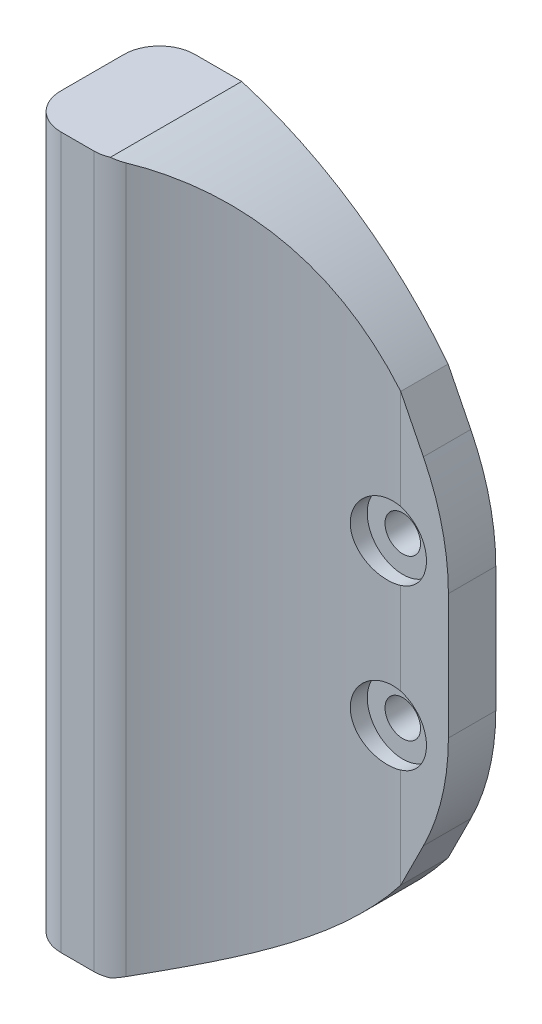
ISO-10303-21;
HEADER;
FILE_DESCRIPTION(('STEP AP214'),'2;1');
FILE_NAME('part.step','',(''),(''),'','','');
FILE_SCHEMA(('AUTOMOTIVE_DESIGN { 1 0 10303 214 1 1 1 1 }'));
ENDSEC;
DATA;
#1=APPLICATION_CONTEXT('core data for automotive mechanical design processes');
#2=APPLICATION_PROTOCOL_DEFINITION('international standard','automotive_design',2000,#1);
#3=PRODUCT_CONTEXT('',#1,'mechanical');
#4=PRODUCT('Part','Part','',(#3));
#5=PRODUCT_RELATED_PRODUCT_CATEGORY('part','',(#4));
#6=PRODUCT_DEFINITION_FORMATION('','',#4);
#7=PRODUCT_DEFINITION_CONTEXT('part definition',#1,'design');
#8=PRODUCT_DEFINITION('design','',#6,#7);
#9=PRODUCT_DEFINITION_SHAPE('','',#8);
#10=(LENGTH_UNIT() NAMED_UNIT(*) SI_UNIT(.MILLI.,.METRE.));
#11=(NAMED_UNIT(*) PLANE_ANGLE_UNIT() SI_UNIT($,.RADIAN.));
#12=(NAMED_UNIT(*) SI_UNIT($,.STERADIAN.) SOLID_ANGLE_UNIT());
#13=UNCERTAINTY_MEASURE_WITH_UNIT(LENGTH_MEASURE(1.E-05),#10,'distance_accuracy_value','');
#14=(GEOMETRIC_REPRESENTATION_CONTEXT(3) GLOBAL_UNCERTAINTY_ASSIGNED_CONTEXT((#13)) GLOBAL_UNIT_ASSIGNED_CONTEXT((#10,
#11,#12)) REPRESENTATION_CONTEXT('',''));
#15=CARTESIAN_POINT('',(0.,0.,0.));
#16=DIRECTION('',(0.,0.,1.));
#17=DIRECTION('',(1.,0.,0.));
#18=AXIS2_PLACEMENT_3D('',#15,#16,#17);
#19=CARTESIAN_POINT('',(0.,0.,0.));
#20=DIRECTION('',(0.,0.,1.));
#21=DIRECTION('',(1.,0.,0.));
#22=AXIS2_PLACEMENT_3D('',#19,#20,#21);
#23=PLANE('',#22);
#24=CARTESIAN_POINT('',(-38.1834673777122,-3.10098219645823,0.));
#25=DIRECTION('',(0.,0.,1.));
#26=DIRECTION('',(1.,0.,0.));
#27=AXIS2_PLACEMENT_3D('',#24,#25,#26);
#28=CIRCLE('',#27,34.5491156058735);
#29=CARTESIAN_POINT('',(-10.8667709605561,18.0517832492452,0.));
#30=VERTEX_POINT('',#29);
#31=CARTESIAN_POINT('',(-28.2856713211264,30.,0.));
#32=VERTEX_POINT('',#31);
#33=EDGE_CURVE('E458',#30,#32,#28,.T.);
#34=ORIENTED_EDGE('',*,*,#33,.F.);
#35=DIRECTION('',(0.447213595499958,-0.894427190999916,0.));
#36=VECTOR('',#35,1.);
#37=CARTESIAN_POINT('',(-1.47270346874683,-0.736351734373416,0.));
#38=LINE('',#37,#36);
#39=CARTESIAN_POINT('',(-8.95233551593522,14.2229123600034,0.));
#40=VERTEX_POINT('',#39);
#41=EDGE_CURVE('E399',#30,#40,#38,.T.);
#42=ORIENTED_EDGE('',*,*,#41,.T.);
#43=CARTESIAN_POINT('',(-26.8408793359335,5.2786404500042,0.));
#44=DIRECTION('',(0.,0.,1.));
#45=DIRECTION('',(1.,0.,0.));
#46=AXIS2_PLACEMENT_3D('',#43,#44,#45);
#47=CIRCLE('',#46,20.);
#48=CARTESIAN_POINT('',(-6.84087933593354,5.2786404500042,0.));
#49=VERTEX_POINT('',#48);
#50=EDGE_CURVE('E318',#40,#49,#47,.F.);
#51=ORIENTED_EDGE('',*,*,#50,.T.);
#52=DIRECTION('',(0.,-1.,0.));
#53=VECTOR('',#52,1.);
#54=CARTESIAN_POINT('',(-6.84087933593354,0.,0.));
#55=LINE('',#54,#53);
#56=CARTESIAN_POINT('',(-6.84087933593354,-5.27864045000421,0.));
#57=VERTEX_POINT('',#56);
#58=EDGE_CURVE('E336',#49,#57,#55,.T.);
#59=ORIENTED_EDGE('',*,*,#58,.T.);
#60=CARTESIAN_POINT('',(-26.8408793359335,-5.27864045000422,0.));
#61=DIRECTION('',(0.,0.,1.));
#62=DIRECTION('',(1.,0.,0.));
#63=AXIS2_PLACEMENT_3D('',#60,#61,#62);
#64=CIRCLE('',#63,20.);
#65=CARTESIAN_POINT('',(-8.95233551593522,-14.2229123600034,0.));
#66=VERTEX_POINT('',#65);
#67=EDGE_CURVE('E321',#57,#66,#64,.F.);
#68=ORIENTED_EDGE('',*,*,#67,.T.);
#69=DIRECTION('',(0.447213595499958,0.894427190999916,0.));
#70=VECTOR('',#69,1.);
#71=CARTESIAN_POINT('',(-1.47270346874683,0.736351734373416,0.));
#72=LINE('',#71,#70);
#73=CARTESIAN_POINT('',(-10.8667709605561,-18.0517832492452,0.));
#74=VERTEX_POINT('',#73);
#75=EDGE_CURVE('E315',#74,#66,#72,.T.);
#76=ORIENTED_EDGE('',*,*,#75,.F.);
#77=CARTESIAN_POINT('',(-38.1834673777122,3.10098219645824,0.));
#78=DIRECTION('',(0.,0.,1.));
#79=DIRECTION('',(1.,0.,0.));
#80=AXIS2_PLACEMENT_3D('',#77,#78,#79);
#81=CIRCLE('',#80,34.5491156058735);
#82=CARTESIAN_POINT('',(-28.2856713211264,-30.,0.));
#83=VERTEX_POINT('',#82);
#84=EDGE_CURVE('E443',#74,#83,#81,.F.);
#85=ORIENTED_EDGE('',*,*,#84,.T.);
#86=DIRECTION('',(1.,0.,0.));
#87=VECTOR('',#86,1.);
#88=CARTESIAN_POINT('',(-17.6586463212643,-30.,0.));
#89=LINE('',#88,#87);
#90=CARTESIAN_POINT('',(-32.2322315270373,-30.,0.));
#91=VERTEX_POINT('',#90);
#92=EDGE_CURVE('E368',#91,#83,#89,.T.);
#93=ORIENTED_EDGE('',*,*,#92,.F.);
#94=DIRECTION('',(0.,-1.,0.));
#95=VECTOR('',#94,1.);
#96=CARTESIAN_POINT('',(-32.2322315270373,0.,0.));
#97=LINE('',#96,#95);
#98=CARTESIAN_POINT('',(-32.2322315270373,30.,0.));
#99=VERTEX_POINT('',#98);
#100=EDGE_CURVE('E357',#91,#99,#97,.F.);
#101=ORIENTED_EDGE('',*,*,#100,.T.);
#102=DIRECTION('',(-1.,0.,0.));
#103=VECTOR('',#102,1.);
#104=CARTESIAN_POINT('',(-17.6586463212643,30.,0.));
#105=LINE('',#104,#103);
#106=EDGE_CURVE('E372',#32,#99,#105,.T.);
#107=ORIENTED_EDGE('',*,*,#106,.F.);
#108=EDGE_LOOP('',(#34,#42,#51,#59,#68,#76,#85,#93,#101,#107));
#109=FACE_BOUND('',#108,.T.);
#110=CARTESIAN_POINT('',(-11.6913429510899,6.75,0.));
#111=DIRECTION('',(0.,0.,1.));
#112=DIRECTION('',(1.,0.,0.));
#113=AXIS2_PLACEMENT_3D('',#110,#111,#112);
#114=CIRCLE('',#113,1.5);
#115=CARTESIAN_POINT('',(-10.1913429510899,6.75,0.));
#116=VERTEX_POINT('',#115);
#117=EDGE_CURVE('E379',#116,#116,#114,.T.);
#118=ORIENTED_EDGE('',*,*,#117,.T.);
#119=EDGE_LOOP('',(#118));
#120=FACE_BOUND('',#119,.T.);
#121=CARTESIAN_POINT('',(-11.6913429510899,-6.75000000000001,0.));
#122=DIRECTION('',(0.,0.,1.));
#123=DIRECTION('',(1.,0.,0.));
#124=AXIS2_PLACEMENT_3D('',#121,#122,#123);
#125=CIRCLE('',#124,1.5);
#126=CARTESIAN_POINT('',(-10.1913429510899,-6.75000000000001,0.));
#127=VERTEX_POINT('',#126);
#128=EDGE_CURVE('E375',#127,#127,#125,.T.);
#129=ORIENTED_EDGE('',*,*,#128,.T.);
#130=EDGE_LOOP('',(#129));
#131=FACE_BOUND('',#130,.T.);
#132=ADVANCED_FACE('F44',(#109,#120,#131),#23,.F.);
#133=CARTESIAN_POINT('',(-1.47270346874683,-0.736351734373416,-2.));
#134=DIRECTION('',(-0.894427190999916,-0.447213595499958,0.));
#135=DIRECTION('',(0.447213595499958,-0.894427190999916,0.));
#136=AXIS2_PLACEMENT_3D('',#133,#134,#135);
#137=PLANE('',#136);
#138=DIRECTION('',(0.,0.,1.));
#139=VECTOR('',#138,1.);
#140=CARTESIAN_POINT('',(-10.8667709605561,18.0517832492452,0.));
#141=LINE('',#140,#139);
#142=CARTESIAN_POINT('',(-10.8667709605561,18.0517832492452,4.));
#143=VERTEX_POINT('',#142);
#144=EDGE_CURVE('E414',#30,#143,#141,.T.);
#145=ORIENTED_EDGE('',*,*,#144,.T.);
#146=DIRECTION('',(0.447213595499958,-0.894427190999916,0.));
#147=VECTOR('',#146,1.);
#148=CARTESIAN_POINT('',(-1.47270346874683,-0.736351734373416,4.));
#149=LINE('',#148,#147);
#150=CARTESIAN_POINT('',(-8.95233551593522,14.2229123600034,4.));
#151=VERTEX_POINT('',#150);
#152=EDGE_CURVE('E189',#143,#151,#149,.T.);
#153=ORIENTED_EDGE('',*,*,#152,.T.);
#154=DIRECTION('',(0.,0.,1.));
#155=VECTOR('',#154,1.);
#156=CARTESIAN_POINT('',(-8.95233551593522,14.2229123600034,-2.));
#157=LINE('',#156,#155);
#158=EDGE_CURVE('E326',#151,#40,#157,.F.);
#159=ORIENTED_EDGE('',*,*,#158,.T.);
#160=ORIENTED_EDGE('',*,*,#41,.F.);
#161=EDGE_LOOP('',(#145,#153,#159,#160));
#162=FACE_BOUND('',#161,.T.);
#163=ADVANCED_FACE('F275',(#162),#137,.F.);
#164=CARTESIAN_POINT('',(-17.6586463212643,30.,8.));
#165=DIRECTION('',(0.,-1.,0.));
#166=DIRECTION('',(0.,0.,-1.));
#167=AXIS2_PLACEMENT_3D('',#164,#165,#166);
#168=PLANE('',#167);
#169=DIRECTION('',(-1.,0.,0.));
#170=VECTOR('',#169,1.);
#171=CARTESIAN_POINT('',(0.,30.,11.3244811907628));
#172=LINE('',#171,#170);
#173=CARTESIAN_POINT('',(-29.4394069339215,30.,11.3244811907628));
#174=VERTEX_POINT('',#173);
#175=CARTESIAN_POINT('',(-32.2322315270373,30.,11.3244811907628));
#176=VERTEX_POINT('',#175);
#177=EDGE_CURVE('E384',#174,#176,#172,.T.);
#178=ORIENTED_EDGE('',*,*,#177,.F.);
#179=CARTESIAN_POINT('',(-29.4394069339215,30.,8.32448119076275));
#180=DIRECTION('',(0.,-1.,0.));
#181=DIRECTION('',(0.,0.,-1.));
#182=AXIS2_PLACEMENT_3D('',#179,#180,#181);
#183=CIRCLE('',#182,3.);
#184=CARTESIAN_POINT('',(-28.2856713211264,30.,11.0937580161755));
#185=VERTEX_POINT('',#184);
#186=EDGE_CURVE('E59',#174,#185,#183,.F.);
#187=ORIENTED_EDGE('',*,*,#186,.T.);
#188=DIRECTION('',(0.,0.,1.));
#189=VECTOR('',#188,1.);
#190=CARTESIAN_POINT('',(-28.2856713211264,30.,0.));
#191=LINE('',#190,#189);
#192=EDGE_CURVE('E466',#32,#185,#191,.T.);
#193=ORIENTED_EDGE('',*,*,#192,.F.);
#194=ORIENTED_EDGE('',*,*,#106,.T.);
#195=CARTESIAN_POINT('',(-32.2322315270373,30.,3.));
#196=DIRECTION('',(0.,-1.,0.));
#197=DIRECTION('',(0.,0.,-1.));
#198=AXIS2_PLACEMENT_3D('',#195,#196,#197);
#199=CIRCLE('',#198,3.);
#200=CARTESIAN_POINT('',(-35.2322315270373,30.,3.));
#201=VERTEX_POINT('',#200);
#202=EDGE_CURVE('E361',#99,#201,#199,.F.);
#203=ORIENTED_EDGE('',*,*,#202,.T.);
#204=DIRECTION('',(0.,0.,-1.));
#205=VECTOR('',#204,1.);
#206=CARTESIAN_POINT('',(-35.2322315270373,30.,0.));
#207=LINE('',#206,#205);
#208=CARTESIAN_POINT('',(-35.2322315270373,30.,8.32448119076275));
#209=VERTEX_POINT('',#208);
#210=EDGE_CURVE('E383',#209,#201,#207,.T.);
#211=ORIENTED_EDGE('',*,*,#210,.F.);
#212=CARTESIAN_POINT('',(-32.2322315270373,30.,8.32448119076275));
#213=DIRECTION('',(0.,-1.,0.));
#214=DIRECTION('',(0.,0.,-1.));
#215=AXIS2_PLACEMENT_3D('',#212,#213,#214);
#216=CIRCLE('',#215,3.);
#217=EDGE_CURVE('E364',#209,#176,#216,.F.);
#218=ORIENTED_EDGE('',*,*,#217,.T.);
#219=EDGE_LOOP('',(#178,#187,#193,#194,#203,#211,#218));
#220=FACE_BOUND('',#219,.T.);
#221=ADVANCED_FACE('F271',(#220),#168,.F.);
#222=CARTESIAN_POINT('',(-11.6913429510899,-6.75000000000001,8.));
#223=DIRECTION('',(0.,0.,-1.));
#224=DIRECTION('',(-1.,0.,0.));
#225=AXIS2_PLACEMENT_3D('',#222,#223,#224);
#226=CYLINDRICAL_SURFACE('',#225,1.5);
#227=ORIENTED_EDGE('',*,*,#128,.F.);
#228=EDGE_LOOP('',(#227));
#229=FACE_BOUND('',#228,.T.);
#230=CARTESIAN_POINT('',(-11.6913429510899,-6.75000000000001,3.));
#231=DIRECTION('',(0.,0.,1.));
#232=DIRECTION('',(1.,0.,0.));
#233=AXIS2_PLACEMENT_3D('',#230,#231,#232);
#234=CIRCLE('',#233,1.5);
#235=CARTESIAN_POINT('',(-10.1913429510899,-6.75000000000001,3.));
#236=VERTEX_POINT('',#235);
#237=EDGE_CURVE('E202',#236,#236,#234,.T.);
#238=ORIENTED_EDGE('',*,*,#237,.T.);
#239=EDGE_LOOP('',(#238));
#240=FACE_BOUND('',#239,.T.);
#241=ADVANCED_FACE('F267',(#229,#240),#226,.F.);
#242=CARTESIAN_POINT('',(-11.6913429510899,6.75,8.));
#243=DIRECTION('',(0.,0.,-1.));
#244=DIRECTION('',(-1.,0.,0.));
#245=AXIS2_PLACEMENT_3D('',#242,#243,#244);
#246=CYLINDRICAL_SURFACE('',#245,1.5);
#247=ORIENTED_EDGE('',*,*,#117,.F.);
#248=EDGE_LOOP('',(#247));
#249=FACE_BOUND('',#248,.T.);
#250=CARTESIAN_POINT('',(-11.6913429510899,6.75,3.));
#251=DIRECTION('',(0.,0.,1.));
#252=DIRECTION('',(1.,0.,0.));
#253=AXIS2_PLACEMENT_3D('',#250,#251,#252);
#254=CIRCLE('',#253,1.5);
#255=CARTESIAN_POINT('',(-10.1913429510899,6.75,3.));
#256=VERTEX_POINT('',#255);
#257=EDGE_CURVE('E207',#256,#256,#254,.T.);
#258=ORIENTED_EDGE('',*,*,#257,.T.);
#259=EDGE_LOOP('',(#258));
#260=FACE_BOUND('',#259,.T.);
#261=ADVANCED_FACE('F263',(#249,#260),#246,.F.);
#262=CARTESIAN_POINT('',(-35.2322315270373,50.9063332802407,0.));
#263=DIRECTION('',(1.,0.,0.));
#264=DIRECTION('',(0.,0.,-1.));
#265=AXIS2_PLACEMENT_3D('',#262,#263,#264);
#266=PLANE('',#265);
#267=ORIENTED_EDGE('',*,*,#210,.T.);
#268=DIRECTION('',(0.,-1.,0.));
#269=VECTOR('',#268,1.);
#270=CARTESIAN_POINT('',(-35.2322315270373,50.9063332802407,3.));
#271=LINE('',#270,#269);
#272=CARTESIAN_POINT('',(-35.2322315270373,-30.,3.));
#273=VERTEX_POINT('',#272);
#274=EDGE_CURVE('E340',#201,#273,#271,.T.);
#275=ORIENTED_EDGE('',*,*,#274,.T.);
#276=DIRECTION('',(0.,0.,1.));
#277=VECTOR('',#276,1.);
#278=CARTESIAN_POINT('',(-35.2322315270373,-30.,0.));
#279=LINE('',#278,#277);
#280=CARTESIAN_POINT('',(-35.2322315270373,-30.,8.32448119076275));
#281=VERTEX_POINT('',#280);
#282=EDGE_CURVE('E387',#273,#281,#279,.T.);
#283=ORIENTED_EDGE('',*,*,#282,.T.);
#284=DIRECTION('',(0.,-1.,0.));
#285=VECTOR('',#284,1.);
#286=CARTESIAN_POINT('',(-35.2322315270373,50.9063332802407,8.32448119076275));
#287=LINE('',#286,#285);
#288=EDGE_CURVE('E344',#281,#209,#287,.F.);
#289=ORIENTED_EDGE('',*,*,#288,.T.);
#290=EDGE_LOOP('',(#267,#275,#283,#289));
#291=FACE_BOUND('',#290,.T.);
#292=ADVANCED_FACE('F266',(#291),#266,.F.);
#293=CARTESIAN_POINT('',(-32.2322315270373,50.9063332802407,3.));
#294=DIRECTION('',(0.,-1.,0.));
#295=DIRECTION('',(0.,0.,-1.));
#296=AXIS2_PLACEMENT_3D('',#293,#294,#295);
#297=CYLINDRICAL_SURFACE('',#296,3.);
#298=ORIENTED_EDGE('',*,*,#202,.F.);
#299=ORIENTED_EDGE('',*,*,#100,.F.);
#300=CARTESIAN_POINT('',(-32.2322315270373,-30.,3.));
#301=DIRECTION('',(0.,1.,0.));
#302=DIRECTION('',(0.,0.,1.));
#303=AXIS2_PLACEMENT_3D('',#300,#301,#302);
#304=CIRCLE('',#303,3.);
#305=EDGE_CURVE('E351',#273,#91,#304,.F.);
#306=ORIENTED_EDGE('',*,*,#305,.F.);
#307=ORIENTED_EDGE('',*,*,#274,.F.);
#308=EDGE_LOOP('',(#298,#299,#306,#307));
#309=FACE_BOUND('',#308,.T.);
#310=ADVANCED_FACE('F283',(#309),#297,.T.);
#311=CARTESIAN_POINT('',(-32.2322315270373,50.9063332802407,8.32448119076275));
#312=DIRECTION('',(0.,-1.,0.));
#313=DIRECTION('',(0.,0.,-1.));
#314=AXIS2_PLACEMENT_3D('',#311,#312,#313);
#315=CYLINDRICAL_SURFACE('',#314,3.);
#316=ORIENTED_EDGE('',*,*,#217,.F.);
#317=ORIENTED_EDGE('',*,*,#288,.F.);
#318=CARTESIAN_POINT('',(-32.2322315270373,-30.,8.32448119076275));
#319=DIRECTION('',(0.,1.,0.));
#320=DIRECTION('',(0.,0.,1.));
#321=AXIS2_PLACEMENT_3D('',#318,#319,#320);
#322=CIRCLE('',#321,3.);
#323=CARTESIAN_POINT('',(-32.2322315270373,-30.,11.3244811907628));
#324=VERTEX_POINT('',#323);
#325=EDGE_CURVE('E354',#324,#281,#322,.F.);
#326=ORIENTED_EDGE('',*,*,#325,.F.);
#327=DIRECTION('',(0.,-1.,0.));
#328=VECTOR('',#327,1.);
#329=CARTESIAN_POINT('',(-32.2322315270373,50.9063332802407,11.3244811907628));
#330=LINE('',#329,#328);
#331=EDGE_CURVE('E347',#176,#324,#330,.T.);
#332=ORIENTED_EDGE('',*,*,#331,.F.);
#333=EDGE_LOOP('',(#316,#317,#326,#332));
#334=FACE_BOUND('',#333,.T.);
#335=ADVANCED_FACE('F286',(#334),#315,.T.);
#336=CARTESIAN_POINT('',(-26.8408793359335,-5.27864045000422,-2.));
#337=DIRECTION('',(0.,0.,-1.));
#338=DIRECTION('',(-1.,0.,0.));
#339=AXIS2_PLACEMENT_3D('',#336,#337,#338);
#340=CYLINDRICAL_SURFACE('',#339,20.);
#341=CARTESIAN_POINT('',(-26.8408793359335,-5.27864045000422,4.));
#342=DIRECTION('',(0.,0.,-1.));
#343=DIRECTION('',(-1.,0.,0.));
#344=AXIS2_PLACEMENT_3D('',#341,#342,#343);
#345=CIRCLE('',#344,20.);
#346=CARTESIAN_POINT('',(-8.95233551593522,-14.2229123600034,4.));
#347=VERTEX_POINT('',#346);
#348=CARTESIAN_POINT('',(-6.84087933593354,-5.27864045000422,4.));
#349=VERTEX_POINT('',#348);
#350=EDGE_CURVE('E225',#347,#349,#345,.F.);
#351=ORIENTED_EDGE('',*,*,#350,.F.);
#352=DIRECTION('',(0.,0.,1.));
#353=VECTOR('',#352,1.);
#354=CARTESIAN_POINT('',(-8.95233551593522,-14.2229123600034,8.));
#355=LINE('',#354,#353);
#356=EDGE_CURVE('E310',#66,#347,#355,.T.);
#357=ORIENTED_EDGE('',*,*,#356,.F.);
#358=ORIENTED_EDGE('',*,*,#67,.F.);
#359=DIRECTION('',(0.,0.,1.));
#360=VECTOR('',#359,1.);
#361=CARTESIAN_POINT('',(-6.84087933593354,-5.27864045000421,0.));
#362=LINE('',#361,#360);
#363=EDGE_CURVE('E311',#349,#57,#362,.F.);
#364=ORIENTED_EDGE('',*,*,#363,.F.);
#365=EDGE_LOOP('',(#351,#357,#358,#364));
#366=FACE_BOUND('',#365,.T.);
#367=ADVANCED_FACE('F290',(#366),#340,.T.);
#368=CARTESIAN_POINT('',(-1.47270346874683,0.736351734373416,-2.));
#369=DIRECTION('',(0.894427190999916,-0.447213595499958,0.));
#370=DIRECTION('',(0.447213595499958,0.894427190999916,0.));
#371=AXIS2_PLACEMENT_3D('',#368,#369,#370);
#372=PLANE('',#371);
#373=DIRECTION('',(0.,0.,1.));
#374=VECTOR('',#373,1.);
#375=CARTESIAN_POINT('',(-10.8667709605561,-18.0517832492452,0.));
#376=LINE('',#375,#374);
#377=CARTESIAN_POINT('',(-10.8667709605561,-18.0517832492452,4.));
#378=VERTEX_POINT('',#377);
#379=EDGE_CURVE('E447',#74,#378,#376,.T.);
#380=ORIENTED_EDGE('',*,*,#379,.F.);
#381=ORIENTED_EDGE('',*,*,#75,.T.);
#382=ORIENTED_EDGE('',*,*,#356,.T.);
#383=DIRECTION('',(0.447213595499958,0.894427190999916,0.));
#384=VECTOR('',#383,1.);
#385=CARTESIAN_POINT('',(-1.47270346874683,0.736351734373416,4.));
#386=LINE('',#385,#384);
#387=EDGE_CURVE('E197',#378,#347,#386,.T.);
#388=ORIENTED_EDGE('',*,*,#387,.F.);
#389=EDGE_LOOP('',(#380,#381,#382,#388));
#390=FACE_BOUND('',#389,.T.);
#391=ADVANCED_FACE('F295',(#390),#372,.T.);
#392=CARTESIAN_POINT('',(-26.8408793359335,5.2786404500042,-2.));
#393=DIRECTION('',(0.,0.,1.));
#394=DIRECTION('',(1.,0.,0.));
#395=AXIS2_PLACEMENT_3D('',#392,#393,#394);
#396=CYLINDRICAL_SURFACE('',#395,20.);
#397=CARTESIAN_POINT('',(-26.8408793359335,5.2786404500042,4.));
#398=DIRECTION('',(0.,0.,-1.));
#399=DIRECTION('',(-1.,0.,0.));
#400=AXIS2_PLACEMENT_3D('',#397,#398,#399);
#401=CIRCLE('',#400,20.);
#402=CARTESIAN_POINT('',(-6.84087933593354,5.2786404500042,4.));
#403=VERTEX_POINT('',#402);
#404=EDGE_CURVE('E404',#403,#151,#401,.F.);
#405=ORIENTED_EDGE('',*,*,#404,.F.);
#406=DIRECTION('',(0.,0.,1.));
#407=VECTOR('',#406,1.);
#408=CARTESIAN_POINT('',(-6.84087933593354,5.2786404500042,-2.));
#409=LINE('',#408,#407);
#410=EDGE_CURVE('E330',#49,#403,#409,.T.);
#411=ORIENTED_EDGE('',*,*,#410,.F.);
#412=ORIENTED_EDGE('',*,*,#50,.F.);
#413=ORIENTED_EDGE('',*,*,#158,.F.);
#414=EDGE_LOOP('',(#405,#411,#412,#413));
#415=FACE_BOUND('',#414,.T.);
#416=ADVANCED_FACE('F292',(#415),#396,.T.);
#417=CARTESIAN_POINT('',(-6.84087933593354,0.,-2.));
#418=DIRECTION('',(-1.,0.,0.));
#419=DIRECTION('',(0.,-1.,0.));
#420=AXIS2_PLACEMENT_3D('',#417,#418,#419);
#421=PLANE('',#420);
#422=ORIENTED_EDGE('',*,*,#410,.T.);
#423=DIRECTION('',(0.,-1.,0.));
#424=VECTOR('',#423,1.);
#425=CARTESIAN_POINT('',(-6.84087933593354,30.,4.));
#426=LINE('',#425,#424);
#427=EDGE_CURVE('E191',#403,#349,#426,.T.);
#428=ORIENTED_EDGE('',*,*,#427,.T.);
#429=ORIENTED_EDGE('',*,*,#363,.T.);
#430=ORIENTED_EDGE('',*,*,#58,.F.);
#431=EDGE_LOOP('',(#422,#428,#429,#430));
#432=FACE_BOUND('',#431,.T.);
#433=ADVANCED_FACE('F294',(#432),#421,.F.);
#434=CARTESIAN_POINT('',(0.,50.9063332802407,11.3244811907628));
#435=DIRECTION('',(0.,0.,-1.));
#436=DIRECTION('',(-1.,0.,0.));
#437=AXIS2_PLACEMENT_3D('',#434,#435,#436);
#438=PLANE('',#437);
#439=DIRECTION('',(1.,0.,0.));
#440=VECTOR('',#439,1.);
#441=CARTESIAN_POINT('',(0.,-30.,11.3244811907628));
#442=LINE('',#441,#440);
#443=CARTESIAN_POINT('',(-29.4394069339215,-30.,11.3244811907628));
#444=VERTEX_POINT('',#443);
#445=EDGE_CURVE('E391',#324,#444,#442,.T.);
#446=ORIENTED_EDGE('',*,*,#445,.T.);
#447=DIRECTION('',(0.,-1.,0.));
#448=VECTOR('',#447,1.);
#449=CARTESIAN_POINT('',(-29.4394069339215,50.9063332802407,11.3244811907628));
#450=LINE('',#449,#448);
#451=EDGE_CURVE('E73',#444,#174,#450,.F.);
#452=ORIENTED_EDGE('',*,*,#451,.T.);
#453=ORIENTED_EDGE('',*,*,#177,.T.);
#454=ORIENTED_EDGE('',*,*,#331,.T.);
#455=EDGE_LOOP('',(#446,#452,#453,#454));
#456=FACE_BOUND('',#455,.T.);
#457=ADVANCED_FACE('F257',(#456),#438,.F.);
#458=CARTESIAN_POINT('',(-17.6586463212643,-30.,8.));
#459=DIRECTION('',(0.,1.,0.));
#460=DIRECTION('',(0.,0.,1.));
#461=AXIS2_PLACEMENT_3D('',#458,#459,#460);
#462=PLANE('',#461);
#463=DIRECTION('',(0.,0.,1.));
#464=VECTOR('',#463,1.);
#465=CARTESIAN_POINT('',(-28.2856713211264,-30.,0.));
#466=LINE('',#465,#464);
#467=CARTESIAN_POINT('',(-28.2856713211264,-30.,11.0937580161755));
#468=VERTEX_POINT('',#467);
#469=EDGE_CURVE('E451',#83,#468,#466,.T.);
#470=ORIENTED_EDGE('',*,*,#469,.T.);
#471=CARTESIAN_POINT('',(-29.4394069339215,-30.,8.32448119076275));
#472=DIRECTION('',(0.,1.,0.));
#473=DIRECTION('',(0.,0.,1.));
#474=AXIS2_PLACEMENT_3D('',#471,#472,#473);
#475=CIRCLE('',#474,3.);
#476=EDGE_CURVE('E496',#468,#444,#475,.F.);
#477=ORIENTED_EDGE('',*,*,#476,.T.);
#478=ORIENTED_EDGE('',*,*,#445,.F.);
#479=ORIENTED_EDGE('',*,*,#325,.T.);
#480=ORIENTED_EDGE('',*,*,#282,.F.);
#481=ORIENTED_EDGE('',*,*,#305,.T.);
#482=ORIENTED_EDGE('',*,*,#92,.T.);
#483=EDGE_LOOP('',(#470,#477,#478,#479,#480,#481,#482));
#484=FACE_BOUND('',#483,.T.);
#485=ADVANCED_FACE('F277',(#484),#462,.F.);
#486=CARTESIAN_POINT('',(0.,30.,4.));
#487=DIRECTION('',(0.,0.,-1.));
#488=DIRECTION('',(-1.,0.,0.));
#489=AXIS2_PLACEMENT_3D('',#486,#487,#488);
#490=PLANE('',#489);
#491=DIRECTION('',(0.,-1.,0.));
#492=VECTOR('',#491,1.);
#493=CARTESIAN_POINT('',(-10.8667709605561,30.,4.));
#494=LINE('',#493,#492);
#495=CARTESIAN_POINT('',(-10.8667709605561,9.63445506680674,4.));
#496=VERTEX_POINT('',#495);
#497=EDGE_CURVE('E168',#143,#496,#494,.T.);
#498=ORIENTED_EDGE('',*,*,#497,.T.);
#499=CARTESIAN_POINT('',(-11.6913429510899,6.74999999999999,4.));
#500=DIRECTION('',(0.,0.,-1.));
#501=DIRECTION('',(-1.,0.,0.));
#502=AXIS2_PLACEMENT_3D('',#499,#500,#501);
#503=CIRCLE('',#502,3.);
#504=CARTESIAN_POINT('',(-10.8667709605561,3.86554493319324,4.));
#505=VERTEX_POINT('',#504);
#506=EDGE_CURVE('E178',#496,#505,#503,.T.);
#507=ORIENTED_EDGE('',*,*,#506,.T.);
#508=CARTESIAN_POINT('',(-10.8667709605561,-3.86554493319325,4.));
#509=VERTEX_POINT('',#508);
#510=EDGE_CURVE('E171',#505,#509,#494,.T.);
#511=ORIENTED_EDGE('',*,*,#510,.T.);
#512=CARTESIAN_POINT('',(-11.6913429510899,-6.75000000000001,4.));
#513=DIRECTION('',(0.,0.,-1.));
#514=DIRECTION('',(-1.,0.,0.));
#515=AXIS2_PLACEMENT_3D('',#512,#513,#514);
#516=CIRCLE('',#515,3.);
#517=CARTESIAN_POINT('',(-10.8667709605561,-9.63445506680676,4.));
#518=VERTEX_POINT('',#517);
#519=EDGE_CURVE('E183',#509,#518,#516,.T.);
#520=ORIENTED_EDGE('',*,*,#519,.T.);
#521=EDGE_CURVE('E193',#518,#378,#494,.T.);
#522=ORIENTED_EDGE('',*,*,#521,.T.);
#523=ORIENTED_EDGE('',*,*,#387,.T.);
#524=ORIENTED_EDGE('',*,*,#350,.T.);
#525=ORIENTED_EDGE('',*,*,#427,.F.);
#526=ORIENTED_EDGE('',*,*,#404,.T.);
#527=ORIENTED_EDGE('',*,*,#152,.F.);
#528=EDGE_LOOP('',(#498,#507,#511,#520,#522,#523,#524,#525,#526,#527));
#529=FACE_BOUND('',#528,.T.);
#530=ADVANCED_FACE('F187',(#529),#490,.F.);
#531=CARTESIAN_POINT('',(-11.6913429510899,-6.75000000000001,5.));
#532=DIRECTION('',(0.,0.,1.));
#533=DIRECTION('',(1.,0.,0.));
#534=AXIS2_PLACEMENT_3D('',#531,#532,#533);
#535=CYLINDRICAL_SURFACE('',#534,3.);
#536=ORIENTED_EDGE('',*,*,#519,.F.);
#537=CARTESIAN_POINT('',(-10.8667709605561,-3.86554493319325,4.));
#538=CARTESIAN_POINT('',(-10.947785184297,-3.84237674059419,4.00332209140222));
#539=CARTESIAN_POINT('',(-11.0297599699394,-3.82264383542424,4.00705583368365));
#540=CARTESIAN_POINT('',(-11.1950312335022,-3.79014291306791,4.01534856494678));
#541=CARTESIAN_POINT('',(-11.2783276059473,-3.77737434290928,4.01990748837034));
#542=CARTESIAN_POINT('',(-11.4455648032387,-3.75890273056541,4.02984765305805));
#543=CARTESIAN_POINT('',(-11.5295048299252,-3.7531920298922,4.03522799586287));
#544=CARTESIAN_POINT('',(-11.6974901395763,-3.74882828246525,4.04678465359361));
#545=CARTESIAN_POINT('',(-11.7815354219503,-3.75017519629276,4.05296096407364));
#546=CARTESIAN_POINT('',(-12.0329968364627,-3.76480260977486,4.07262729678885));
#547=CARTESIAN_POINT('',(-12.1998362426176,-3.78865911126827,4.08726053006643));
#548=CARTESIAN_POINT('',(-12.5268640547747,-3.8638093325257,4.11892194353741));
#549=CARTESIAN_POINT('',(-12.6870528799721,-3.91510132015533,4.13594997248579));
#550=CARTESIAN_POINT('',(-12.9974509087582,-4.04399304830484,4.17159025465712));
#551=CARTESIAN_POINT('',(-13.1475942929296,-4.12174916627409,4.19021142048546));
#552=CARTESIAN_POINT('',(-13.4327113193153,-4.30131985192237,4.22778422653383));
#553=CARTESIAN_POINT('',(-13.5676821434325,-4.40313887810076,4.24673592739365));
#554=CARTESIAN_POINT('',(-13.8195914135521,-4.62883258322419,4.28379876715042));
#555=CARTESIAN_POINT('',(-13.93639816767,-4.75285547264766,4.30190315718714));
#556=CARTESIAN_POINT('',(-14.1474920073347,-5.01905139739605,4.33578082662383));
#557=CARTESIAN_POINT('',(-14.2417809116314,-5.16122296544149,4.3515542942514));
#558=CARTESIAN_POINT('',(-14.4046398287768,-5.45900337969904,4.37945691046879));
#559=CARTESIAN_POINT('',(-14.473336768044,-5.61454107175072,4.39160398330006));
#560=CARTESIAN_POINT('',(-14.5835572222167,-5.93523776789629,4.41136256445043));
#561=CARTESIAN_POINT('',(-14.6250829658366,-6.10039598165736,4.41897444476364));
#562=CARTESIAN_POINT('',(-14.6792381982735,-6.43304208525063,4.42894333116773));
#563=CARTESIAN_POINT('',(-14.6922831287315,-6.60046013324449,4.43137587361315));
#564=CARTESIAN_POINT('',(-14.6902972892391,-6.93511794670093,4.43100725165476));
#565=CARTESIAN_POINT('',(-14.6752681412075,-7.10235772190431,4.42820638959948));
#566=CARTESIAN_POINT('',(-14.6178551016061,-7.43046960798606,4.41765131195713));
#567=CARTESIAN_POINT('',(-14.5756988670233,-7.59138299428905,4.40993832558604));
#568=CARTESIAN_POINT('',(-14.4655364220009,-7.90381595238043,4.39022341235501));
#569=CARTESIAN_POINT('',(-14.3975296724171,-8.05533532816845,4.37822139604235));
#570=CARTESIAN_POINT('',(-14.2370433873277,-8.34598901094232,4.35076131159705));
#571=CARTESIAN_POINT('',(-14.1443796795205,-8.4850191175948,4.33527737642525));
#572=CARTESIAN_POINT('',(-13.9374556665756,-8.74566372947424,4.30207686334978));
#573=CARTESIAN_POINT('',(-13.823192220541,-8.86727569733996,4.28435996086721));
#574=CARTESIAN_POINT('',(-13.5743790169096,-9.09150235774908,4.24769102267049));
#575=CARTESIAN_POINT('',(-13.439554762935,-9.1938102050553,4.22872461768526));
#576=CARTESIAN_POINT('',(-13.1546271575468,-9.37435448501354,4.19110155825487));
#577=CARTESIAN_POINT('',(-13.0045252353466,-9.45259316656693,4.17244487502507));
#578=CARTESIAN_POINT('',(-12.6922443885539,-9.58320106228446,4.13650535914423));
#579=CARTESIAN_POINT('',(-12.5299982036035,-9.63541171584181,4.11923147266349));
#580=CARTESIAN_POINT('',(-12.1986679752897,-9.71166764826076,4.08714138338382));
#581=CARTESIAN_POINT('',(-12.0295835108978,-9.73571119015136,4.07232533219968));
#582=CARTESIAN_POINT('',(-11.7763413201102,-9.74996370142462,4.05257295393944));
#583=CARTESIAN_POINT('',(-11.6927582433721,-9.751164791128,4.04644615329481));
#584=CARTESIAN_POINT('',(-11.5257069298407,-9.74658741719169,4.03498032620408));
#585=CARTESIAN_POINT('',(-11.4422386918077,-9.74080902949515,4.02964129118706));
#586=CARTESIAN_POINT('',(-11.2759573213613,-9.72228188011536,4.01977557286728));
#587=CARTESIAN_POINT('',(-11.1931448718723,-9.70952662823432,4.0152496511755));
#588=CARTESIAN_POINT('',(-11.0288286648816,-9.67713174533638,4.00701347308537));
#589=CARTESIAN_POINT('',(-10.9473250295621,-9.6574914754426,4.00330329243354));
#590=CARTESIAN_POINT('',(-10.8667709605561,-9.63445506680676,4.));
#591=B_SPLINE_CURVE_WITH_KNOTS('',3,(#537,#538,#539,#540,#541,#542,#543,#544,#545,#546,#547,
#548,#549,#550,#551,#552,#553,#554,#555,#556,#557,#558,#559,#560,#561,#562,#563,#564,#565,#566,
#567,#568,#569,#570,#571,#572,#573,#574,#575,#576,#577,#578,#579,#580,#581,#582,#583,#584,#585,
#586,#587,#588,#589,#590),.UNSPECIFIED.,.F.,.F.,(4,2,2,2,2,2,2,2,2,2,2,2,2,2,2,2,2,2,2,2,2,2,2,
2,2,2,4),(0.,0.252898304659466,0.505776526122283,0.758380108046116,1.01098227910933,
1.51589496293122,2.02077577294544,2.52869328521667,3.03670498094116,3.54824346452464,
4.05974061754453,4.56866605518418,5.07754974303351,5.57895946019721,6.0803402104039,
6.57756717880122,7.07480451805065,7.57586557490905,8.0769995490085,8.58552918144188,
9.09401128499207,9.60555428034706,10.117128819177,10.3683366349821,10.6195417174391,
10.8709808807467,11.1224433818588),.UNSPECIFIED.);
#592=EDGE_CURVE('E175',#509,#518,#591,.T.);
#593=ORIENTED_EDGE('',*,*,#592,.T.);
#594=EDGE_LOOP('',(#536,#593));
#595=FACE_BOUND('',#594,.T.);
#596=CARTESIAN_POINT('',(-11.6913429510899,-6.75000000000001,3.));
#597=DIRECTION('',(0.,0.,1.));
#598=DIRECTION('',(1.,0.,0.));
#599=AXIS2_PLACEMENT_3D('',#596,#597,#598);
#600=CIRCLE('',#599,3.);
#601=CARTESIAN_POINT('',(-8.69134295108992,-6.75000000000001,3.));
#602=VERTEX_POINT('',#601);
#603=EDGE_CURVE('E463',#602,#602,#600,.T.);
#604=ORIENTED_EDGE('',*,*,#603,.F.);
#605=EDGE_LOOP('',(#604));
#606=FACE_BOUND('',#605,.T.);
#607=ADVANCED_FACE('F256',(#595,#606),#535,.F.);
#608=CARTESIAN_POINT('',(-11.6913429510899,6.74999999999999,5.));
#609=DIRECTION('',(0.,0.,1.));
#610=DIRECTION('',(1.,0.,0.));
#611=AXIS2_PLACEMENT_3D('',#608,#609,#610);
#612=CYLINDRICAL_SURFACE('',#611,3.);
#613=ORIENTED_EDGE('',*,*,#506,.F.);
#614=CARTESIAN_POINT('',(-10.8667709605561,9.63445506680674,4.));
#615=CARTESIAN_POINT('',(-10.947785184297,9.6576232594058,4.00332209140222));
#616=CARTESIAN_POINT('',(-11.0297599699394,9.67735616457575,4.00705583368364));
#617=CARTESIAN_POINT('',(-11.1950312335022,9.70985708693209,4.01534856494678));
#618=CARTESIAN_POINT('',(-11.2783276059473,9.72262565709072,4.01990748837034));
#619=CARTESIAN_POINT('',(-11.4455648032387,9.74109726943459,4.02984765305805));
#620=CARTESIAN_POINT('',(-11.5295048299252,9.7468079701078,4.03522799586287));
#621=CARTESIAN_POINT('',(-11.6974901395763,9.75117171753474,4.04678465359361));
#622=CARTESIAN_POINT('',(-11.7815354219503,9.74982480370724,4.05296096407364));
#623=CARTESIAN_POINT('',(-12.0329968364627,9.73519739022514,4.07262729678885));
#624=CARTESIAN_POINT('',(-12.1998362426176,9.71134088873173,4.08726053006644));
#625=CARTESIAN_POINT('',(-12.5268640547747,9.6361906674743,4.11892194353741));
#626=CARTESIAN_POINT('',(-12.6870528799721,9.58489867984467,4.13594997248579));
#627=CARTESIAN_POINT('',(-12.9974509087582,9.45600695169516,4.17159025465712));
#628=CARTESIAN_POINT('',(-13.1475942929296,9.37825083372591,4.19021142048546));
#629=CARTESIAN_POINT('',(-13.4327113193153,9.19868014807764,4.22778422653383));
#630=CARTESIAN_POINT('',(-13.5676821434325,9.09686112189924,4.24673592739365));
#631=CARTESIAN_POINT('',(-13.8195914135521,8.87116741677582,4.28379876715042));
#632=CARTESIAN_POINT('',(-13.93639816767,8.74714452735234,4.30190315718713));
#633=CARTESIAN_POINT('',(-14.1474920073347,8.48094860260395,4.33578082662382));
#634=CARTESIAN_POINT('',(-14.2417809116314,8.33877703455851,4.3515542942514));
#635=CARTESIAN_POINT('',(-14.4046398287768,8.04099662030096,4.37945691046879));
#636=CARTESIAN_POINT('',(-14.4733367680441,7.88545892824928,4.39160398330006));
#637=CARTESIAN_POINT('',(-14.5835572222167,7.56476223210372,4.41136256445043));
#638=CARTESIAN_POINT('',(-14.6250829658366,7.39960401834264,4.41897444476364));
#639=CARTESIAN_POINT('',(-14.6792381982735,7.06695791474937,4.42894333116773));
#640=CARTESIAN_POINT('',(-14.6922831287315,6.89953986675551,4.43137587361315));
#641=CARTESIAN_POINT('',(-14.6902972892391,6.56488205329908,4.43100725165476));
#642=CARTESIAN_POINT('',(-14.6752681412075,6.39764227809569,4.42820638959948));
#643=CARTESIAN_POINT('',(-14.6178551016062,6.06953039201394,4.41765131195714));
#644=CARTESIAN_POINT('',(-14.5756988670233,5.90861700571095,4.40993832558604));
#645=CARTESIAN_POINT('',(-14.465536422001,5.59618404761957,4.390223412355));
#646=CARTESIAN_POINT('',(-14.3975296724171,5.44466467183156,4.37822139604235));
#647=CARTESIAN_POINT('',(-14.2370433873277,5.15401098905768,4.35076131159705));
#648=CARTESIAN_POINT('',(-14.1443796795205,5.0149808824052,4.33527737642526));
#649=CARTESIAN_POINT('',(-13.9374556665756,4.75433627052576,4.30207686334978));
#650=CARTESIAN_POINT('',(-13.8231922205411,4.63272430266004,4.28435996086721));
#651=CARTESIAN_POINT('',(-13.5743790169096,4.40849764225092,4.2476910226705));
#652=CARTESIAN_POINT('',(-13.439554762935,4.3061897949447,4.22872461768527));
#653=CARTESIAN_POINT('',(-13.1546271575468,4.12564551498645,4.19110155825488));
#654=CARTESIAN_POINT('',(-13.0045252353466,4.04740683343307,4.17244487502507));
#655=CARTESIAN_POINT('',(-12.6922443885539,3.91679893771554,4.13650535914424));
#656=CARTESIAN_POINT('',(-12.5299982036035,3.86458828415819,4.11923147266349));
#657=CARTESIAN_POINT('',(-12.1986679752898,3.78833235173924,4.08714138338382));
#658=CARTESIAN_POINT('',(-12.0295835108978,3.76428880984864,4.07232533219967));
#659=CARTESIAN_POINT('',(-11.7763413201102,3.75003629857537,4.05257295393944));
#660=CARTESIAN_POINT('',(-11.6927582433721,3.74883520887199,4.04644615329481));
#661=CARTESIAN_POINT('',(-11.5257069298407,3.7534125828083,4.03498032620408));
#662=CARTESIAN_POINT('',(-11.4422386918077,3.75919097050484,4.02964129118706));
#663=CARTESIAN_POINT('',(-11.2759573213613,3.77771811988464,4.01977557286728));
#664=CARTESIAN_POINT('',(-11.1931448718723,3.79047337176567,4.01524965117549));
#665=CARTESIAN_POINT('',(-11.0288286648816,3.82286825466361,4.00701347308537));
#666=CARTESIAN_POINT('',(-10.9473250295621,3.84250852455739,4.00330329243354));
#667=CARTESIAN_POINT('',(-10.8667709605561,3.86554493319324,4.));
#668=B_SPLINE_CURVE_WITH_KNOTS('',3,(#614,#615,#616,#617,#618,#619,#620,#621,#622,#623,#624,
#625,#626,#627,#628,#629,#630,#631,#632,#633,#634,#635,#636,#637,#638,#639,#640,#641,#642,#643,
#644,#645,#646,#647,#648,#649,#650,#651,#652,#653,#654,#655,#656,#657,#658,#659,#660,#661,#662,
#663,#664,#665,#666,#667),.UNSPECIFIED.,.F.,.F.,(4,2,2,2,2,2,2,2,2,2,2,2,2,2,2,2,2,2,2,2,2,2,2,
2,2,2,4),(0.,0.252898304659464,0.505776526122279,0.758380108046114,1.01098227910932,
1.51589496293122,2.02077577294544,2.52869328521667,3.03670498094116,3.54824346452464,
4.05974061754453,4.56866605518419,5.07754974303352,5.57895946019721,6.0803402104039,
6.57756717880122,7.07480451805066,7.57586557490906,8.07699954900851,8.58552918144189,
9.09401128499207,9.60555428034707,10.117128819177,10.3683366349821,10.6195417174391,
10.8709808807467,11.1224433818588),.UNSPECIFIED.);
#669=EDGE_CURVE('E163',#496,#505,#668,.T.);
#670=ORIENTED_EDGE('',*,*,#669,.T.);
#671=EDGE_LOOP('',(#613,#670));
#672=FACE_BOUND('',#671,.T.);
#673=CARTESIAN_POINT('',(-11.6913429510899,6.74999999999999,3.));
#674=DIRECTION('',(0.,0.,1.));
#675=DIRECTION('',(1.,0.,0.));
#676=AXIS2_PLACEMENT_3D('',#673,#674,#675);
#677=CIRCLE('',#676,3.);
#678=CARTESIAN_POINT('',(-8.69134295108993,6.74999999999999,3.));
#679=VERTEX_POINT('',#678);
#680=EDGE_CURVE('E184',#679,#679,#677,.T.);
#681=ORIENTED_EDGE('',*,*,#680,.F.);
#682=EDGE_LOOP('',(#681));
#683=FACE_BOUND('',#682,.T.);
#684=ADVANCED_FACE('F179',(#672,#683),#612,.F.);
#685=CARTESIAN_POINT('',(0.,0.,3.));
#686=DIRECTION('',(0.,0.,1.));
#687=DIRECTION('',(1.,0.,0.));
#688=AXIS2_PLACEMENT_3D('',#685,#686,#687);
#689=PLANE('',#688);
#690=ORIENTED_EDGE('',*,*,#257,.F.);
#691=EDGE_LOOP('',(#690));
#692=FACE_BOUND('',#691,.T.);
#693=ORIENTED_EDGE('',*,*,#680,.T.);
#694=EDGE_LOOP('',(#693));
#695=FACE_BOUND('',#694,.T.);
#696=ADVANCED_FACE('F255',(#692,#695),#689,.T.);
#697=CARTESIAN_POINT('',(0.,0.,3.));
#698=DIRECTION('',(0.,0.,1.));
#699=DIRECTION('',(1.,0.,0.));
#700=AXIS2_PLACEMENT_3D('',#697,#698,#699);
#701=PLANE('',#700);
#702=ORIENTED_EDGE('',*,*,#237,.F.);
#703=EDGE_LOOP('',(#702));
#704=FACE_BOUND('',#703,.T.);
#705=ORIENTED_EDGE('',*,*,#603,.T.);
#706=EDGE_LOOP('',(#705));
#707=FACE_BOUND('',#706,.T.);
#708=ADVANCED_FACE('F477',(#704,#707),#701,.T.);
#709=CARTESIAN_POINT('',(-38.1834673777122,3.10098219645824,0.));
#710=DIRECTION('',(0.,0.,1.));
#711=DIRECTION('',(1.,0.,0.));
#712=AXIS2_PLACEMENT_3D('',#709,#710,#711);
#713=CYLINDRICAL_SURFACE('',#712,34.5491156058735);
#714=CARTESIAN_POINT('',(-10.8667709605561,-18.0517832492452,4.));
#715=CARTESIAN_POINT('',(-11.093649372373,-18.3447763384163,4.00931649862481));
#716=CARTESIAN_POINT('',(-11.3251812934312,-18.634034927432,4.02168175096265));
#717=CARTESIAN_POINT('',(-11.7972561050898,-19.2047665427529,4.05323916761839));
#718=CARTESIAN_POINT('',(-12.0377998926048,-19.4862387892426,4.07243201308264));
#719=CARTESIAN_POINT('',(-12.7727686442338,-20.3187917702516,4.14137391867204));
#720=CARTESIAN_POINT('',(-13.2802214714377,-20.8576091849829,4.20247566162661));
#721=CARTESIAN_POINT('',(-14.3277757371624,-21.9009367751428,4.36100369180119));
#722=CARTESIAN_POINT('',(-14.8679926146114,-22.4053105315565,4.45856551427132));
#723=CARTESIAN_POINT('',(-15.9742476416656,-23.3741424042914,4.69557015515656));
#724=CARTESIAN_POINT('',(-16.5402776874023,-23.8386129176927,4.83499990514913));
#725=CARTESIAN_POINT('',(-17.6963456486781,-24.7280491478014,5.16200727630522));
#726=CARTESIAN_POINT('',(-18.2865300897202,-25.1526975007351,5.34993315294913));
#727=CARTESIAN_POINT('',(-19.4794213057033,-25.9561541904221,5.77767913871376));
#728=CARTESIAN_POINT('',(-20.0821299800746,-26.3349555136615,6.0175071720338));
#729=CARTESIAN_POINT('',(-21.2889476519726,-27.0437442980335,6.55088897384984));
#730=CARTESIAN_POINT('',(-21.8930425351839,-27.3739124718463,6.84423428699862));
#731=CARTESIAN_POINT('',(-23.0955259924609,-27.9868041179025,7.48650142410643));
#732=CARTESIAN_POINT('',(-23.6939167713485,-28.2695466864769,7.83540076790839));
#733=CARTESIAN_POINT('',(-24.6329148750454,-28.6821732177443,8.43364897131295));
#734=CARTESIAN_POINT('',(-24.9784931050081,-28.8271557881495,8.66505880504921));
#735=CARTESIAN_POINT('',(-25.6625714919838,-29.1015679584241,9.14665504940529));
#736=CARTESIAN_POINT('',(-26.0010734454158,-29.2310015462332,9.39683661866944));
#737=CARTESIAN_POINT('',(-26.6701603886016,-29.4752717144719,9.91621530436942));
#738=CARTESIAN_POINT('',(-27.0007220400462,-29.5900687334333,10.1854610209021));
#739=CARTESIAN_POINT('',(-27.6514345855588,-29.8054818228061,10.7417773611099));
#740=CARTESIAN_POINT('',(-27.9715831894862,-29.9060947897277,11.0288518660158));
#741=CARTESIAN_POINT('',(-28.2856713211264,-30.,11.3244811907628));
#742=B_SPLINE_CURVE_WITH_KNOTS('',3,(#714,#715,#716,#717,#718,#719,#720,#721,#722,#723,#724,
#725,#726,#727,#728,#729,#730,#731,#732,#733,#734,#735,#736,#737,#738,#739,#740,#741),
.UNSPECIFIED.,.F.,.F.,(4,2,2,2,2,2,2,2,2,2,2,2,2,4),(0.,1.11192622428564,2.22396340963438,
4.4495505431962,6.6834946399397,8.91674216931242,11.1664961727807,13.4165939016952,
15.6581074609396,17.898716277302,19.2194187127408,20.5397816933339,21.8636410829564,
23.1877896867326),.UNSPECIFIED.);
#743=CARTESIAN_POINT('',(-27.4735284123008,-29.7462185443229,10.5906059971735));
#744=VERTEX_POINT('',#743);
#745=EDGE_CURVE('E176',#378,#744,#742,.T.);
#746=ORIENTED_EDGE('',*,*,#745,.T.);
#747=CARTESIAN_POINT('',(-27.4735284123008,-29.7462185443229,10.5906059971735));
#748=CARTESIAN_POINT('',(-27.5343727865049,-29.7660582267292,10.6433947299647));
#749=CARTESIAN_POINT('',(-27.59725603683,-29.7863733388576,10.6936456804593));
#750=CARTESIAN_POINT('',(-27.7263020010156,-29.8276318601595,10.7885512596427));
#751=CARTESIAN_POINT('',(-27.7924428455206,-29.8485707836014,10.8332375690296));
#752=CARTESIAN_POINT('',(-27.9279423146757,-29.890996094783,10.9171293346555));
#753=CARTESIAN_POINT('',(-27.9973008773955,-29.9124824719825,10.9563348963222));
#754=CARTESIAN_POINT('',(-28.1392491245339,-29.955948092737,11.0292920984485));
#755=CARTESIAN_POINT('',(-28.211855742498,-29.9779295242595,11.0630094959257));
#756=CARTESIAN_POINT('',(-28.2856713211264,-30.,11.0937580161755));
#757=B_SPLINE_CURVE_WITH_KNOTS('',3,(#747,#748,#749,#750,#751,#752,#753,#754,#755,#756),
.UNSPECIFIED.,.F.,.F.,(4,2,2,2,4),(0.,0.2488057362302,0.496123032003391,0.743435569724488,
0.992236492861951),.UNSPECIFIED.);
#758=EDGE_CURVE('E489',#744,#468,#757,.T.);
#759=ORIENTED_EDGE('',*,*,#758,.T.);
#760=ORIENTED_EDGE('',*,*,#469,.F.);
#761=ORIENTED_EDGE('',*,*,#84,.F.);
#762=ORIENTED_EDGE('',*,*,#379,.T.);
#763=EDGE_LOOP('',(#746,#759,#760,#761,#762));
#764=FACE_BOUND('',#763,.T.);
#765=ADVANCED_FACE('F475',(#764),#713,.T.);
#766=CARTESIAN_POINT('',(-38.1834673777122,-3.10098219645823,0.));
#767=DIRECTION('',(0.,0.,1.));
#768=DIRECTION('',(1.,0.,0.));
#769=AXIS2_PLACEMENT_3D('',#766,#767,#768);
#770=CYLINDRICAL_SURFACE('',#769,34.5491156058735);
#771=ORIENTED_EDGE('',*,*,#192,.T.);
#772=CARTESIAN_POINT('',(-28.2856713211264,30.,11.0937580161755));
#773=CARTESIAN_POINT('',(-28.211855742498,29.9779295242595,11.0630094959257));
#774=CARTESIAN_POINT('',(-28.1392491245339,29.955948092737,11.0292920984485));
#775=CARTESIAN_POINT('',(-27.9973008773955,29.9124824719825,10.9563348963222));
#776=CARTESIAN_POINT('',(-27.9279423146757,29.890996094783,10.9171293346555));
#777=CARTESIAN_POINT('',(-27.7924428455206,29.8485707836014,10.8332375690297));
#778=CARTESIAN_POINT('',(-27.7263020010156,29.8276318601595,10.7885512596427));
#779=CARTESIAN_POINT('',(-27.59725603683,29.7863733388576,10.6936456804593));
#780=CARTESIAN_POINT('',(-27.5343727865049,29.7660582267292,10.6433947299647));
#781=CARTESIAN_POINT('',(-27.4735284123008,29.7462185443229,10.5906059971735));
#782=B_SPLINE_CURVE_WITH_KNOTS('',3,(#772,#773,#774,#775,#776,#777,#778,#779,#780,#781),
.UNSPECIFIED.,.F.,.F.,(4,2,2,2,4),(0.,0.248800923137464,0.496113460858558,0.743430756631748,
0.99223649286195),.UNSPECIFIED.);
#783=CARTESIAN_POINT('',(-27.4735284123008,29.7462185443229,10.5906059971735));
#784=VERTEX_POINT('',#783);
#785=EDGE_CURVE('E11',#185,#784,#782,.T.);
#786=ORIENTED_EDGE('',*,*,#785,.T.);
#787=CARTESIAN_POINT('',(-10.8667709605561,18.0517832492452,4.));
#788=CARTESIAN_POINT('',(-11.093649372373,18.3447763384163,4.00931649862482));
#789=CARTESIAN_POINT('',(-11.3251812934312,18.634034927432,4.02168175096266));
#790=CARTESIAN_POINT('',(-11.7972561050897,19.2047665427528,4.05323916761839));
#791=CARTESIAN_POINT('',(-12.0377998926048,19.4862387892426,4.07243201308264));
#792=CARTESIAN_POINT('',(-12.7727686442337,20.3187917702516,4.14137391867203));
#793=CARTESIAN_POINT('',(-13.2802214714377,20.8576091849829,4.20247566162661));
#794=CARTESIAN_POINT('',(-14.3277757371624,21.9009367751428,4.3610036918012));
#795=CARTESIAN_POINT('',(-14.8679926146114,22.4053105315565,4.45856551427133));
#796=CARTESIAN_POINT('',(-15.9742476416656,23.3741424042914,4.69557015515656));
#797=CARTESIAN_POINT('',(-16.5402776874023,23.8386129176927,4.83499990514913));
#798=CARTESIAN_POINT('',(-17.6963456486781,24.7280491478013,5.16200727630521));
#799=CARTESIAN_POINT('',(-18.2865300897202,25.1526975007351,5.34993315294912));
#800=CARTESIAN_POINT('',(-19.4794213057033,25.9561541904221,5.77767913871375));
#801=CARTESIAN_POINT('',(-20.0821299800746,26.3349555136615,6.0175071720338));
#802=CARTESIAN_POINT('',(-21.2889476519726,27.0437442980335,6.55088897384984));
#803=CARTESIAN_POINT('',(-21.8930425351839,27.3739124718463,6.84423428699861));
#804=CARTESIAN_POINT('',(-23.0955259924609,27.9868041179025,7.48650142410642));
#805=CARTESIAN_POINT('',(-23.6939167713485,28.2695466864769,7.83540076790838));
#806=CARTESIAN_POINT('',(-24.6329148750454,28.6821732177443,8.43364897131294));
#807=CARTESIAN_POINT('',(-24.9784931050081,28.8271557881495,8.6650588050492));
#808=CARTESIAN_POINT('',(-25.6625714919838,29.1015679584241,9.14665504940528));
#809=CARTESIAN_POINT('',(-26.0010734454158,29.2310015462332,9.39683661866943));
#810=CARTESIAN_POINT('',(-26.6701603886015,29.4752717144719,9.91621530436941));
#811=CARTESIAN_POINT('',(-27.0007220400462,29.5900687334332,10.1854610209021));
#812=CARTESIAN_POINT('',(-27.6514345855588,29.8054818228061,10.7417773611099));
#813=CARTESIAN_POINT('',(-27.9715831894862,29.9060947897277,11.0288518660158));
#814=CARTESIAN_POINT('',(-28.2856713211264,30.,11.3244811907628));
#815=B_SPLINE_CURVE_WITH_KNOTS('',3,(#787,#788,#789,#790,#791,#792,#793,#794,#795,#796,#797,
#798,#799,#800,#801,#802,#803,#804,#805,#806,#807,#808,#809,#810,#811,#812,#813,#814),
.UNSPECIFIED.,.F.,.F.,(4,2,2,2,2,2,2,2,2,2,2,2,2,4),(0.,1.11192622428564,2.22396340963438,
4.4495505431962,6.68349463993971,8.91674216931242,11.1664961727807,13.4165939016953,
15.6581074609396,17.8987162773021,19.2194187127408,20.5397816933339,21.8636410829564,
23.1877896867326),.UNSPECIFIED.);
#816=EDGE_CURVE('E216',#143,#784,#815,.T.);
#817=ORIENTED_EDGE('',*,*,#816,.F.);
#818=ORIENTED_EDGE('',*,*,#144,.F.);
#819=ORIENTED_EDGE('',*,*,#33,.T.);
#820=EDGE_LOOP('',(#771,#786,#817,#818,#819));
#821=FACE_BOUND('',#820,.T.);
#822=ADVANCED_FACE('F227',(#821),#770,.T.);
#823=CARTESIAN_POINT('',(-9.7579067979134,30.,31.0119133973137));
#824=DIRECTION('',(0.,-1.,0.));
#825=DIRECTION('',(0.,0.,-1.));
#826=AXIS2_PLACEMENT_3D('',#823,#824,#825);
#827=CYLINDRICAL_SURFACE('',#826,27.0346637692273);
#828=ORIENTED_EDGE('',*,*,#816,.T.);
#829=DIRECTION('',(0.,-1.,0.));
#830=VECTOR('',#829,1.);
#831=CARTESIAN_POINT('',(-27.4735284123008,30.,10.5906059971735));
#832=LINE('',#831,#830);
#833=EDGE_CURVE('E224',#784,#744,#832,.T.);
#834=ORIENTED_EDGE('',*,*,#833,.T.);
#835=ORIENTED_EDGE('',*,*,#745,.F.);
#836=ORIENTED_EDGE('',*,*,#521,.F.);
#837=ORIENTED_EDGE('',*,*,#592,.F.);
#838=ORIENTED_EDGE('',*,*,#510,.F.);
#839=ORIENTED_EDGE('',*,*,#669,.F.);
#840=ORIENTED_EDGE('',*,*,#497,.F.);
#841=EDGE_LOOP('',(#828,#834,#835,#836,#837,#838,#839,#840));
#842=FACE_BOUND('',#841,.T.);
#843=ADVANCED_FACE('F166',(#842),#827,.F.);
#844=CARTESIAN_POINT('',(-29.4394069339215,30.,8.32448119076275));
#845=DIRECTION('',(0.,-1.,0.));
#846=DIRECTION('',(0.,0.,-1.));
#847=AXIS2_PLACEMENT_3D('',#844,#845,#846);
#848=CYLINDRICAL_SURFACE('',#847,3.);
#849=ORIENTED_EDGE('',*,*,#186,.F.);
#850=ORIENTED_EDGE('',*,*,#451,.F.);
#851=ORIENTED_EDGE('',*,*,#476,.F.);
#852=ORIENTED_EDGE('',*,*,#758,.F.);
#853=ORIENTED_EDGE('',*,*,#833,.F.);
#854=ORIENTED_EDGE('',*,*,#785,.F.);
#855=EDGE_LOOP('',(#849,#850,#851,#852,#853,#854));
#856=FACE_BOUND('',#855,.T.);
#857=ADVANCED_FACE('F46',(#856),#848,.T.);
#858=CLOSED_SHELL('',(#132,#163,#221,#241,#261,#292,#310,#335,#367,#391,#416,#433,#457,#485,
#530,#607,#684,#696,#708,#765,#822,#843,#857));
#859=MANIFOLD_SOLID_BREP('B2',#858);
#860=ADVANCED_BREP_SHAPE_REPRESENTATION('',(#18,#859),#14);
#861=SHAPE_DEFINITION_REPRESENTATION(#9,#860);
ENDSEC;
END-ISO-10303-21;
